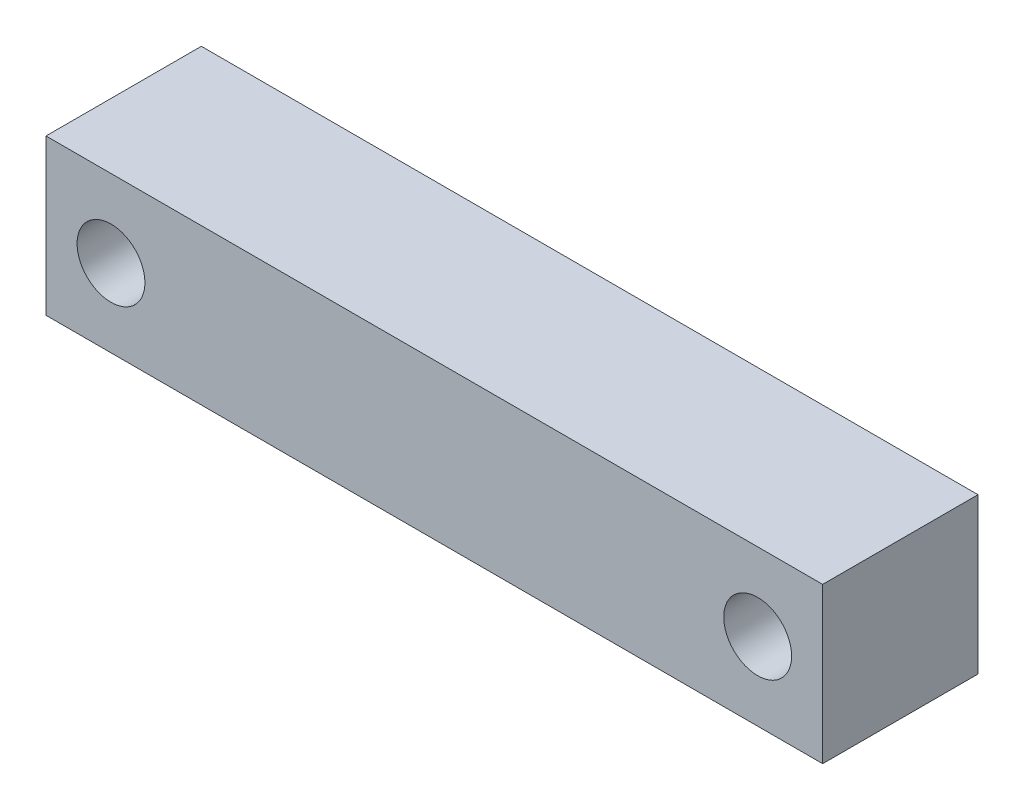
ISO-10303-21;
HEADER;
FILE_DESCRIPTION(('STEP AP214'),'2;1');
FILE_NAME('part.step','',(''),(''),'','','');
FILE_SCHEMA(('AUTOMOTIVE_DESIGN { 1 0 10303 214 1 1 1 1 }'));
ENDSEC;
DATA;
#1=APPLICATION_CONTEXT('core data for automotive mechanical design processes');
#2=APPLICATION_PROTOCOL_DEFINITION('international standard','automotive_design',2000,#1);
#3=PRODUCT_CONTEXT('',#1,'mechanical');
#4=PRODUCT('Part','Part','',(#3));
#5=PRODUCT_RELATED_PRODUCT_CATEGORY('part','',(#4));
#6=PRODUCT_DEFINITION_FORMATION('','',#4);
#7=PRODUCT_DEFINITION_CONTEXT('part definition',#1,'design');
#8=PRODUCT_DEFINITION('design','',#6,#7);
#9=PRODUCT_DEFINITION_SHAPE('','',#8);
#10=(LENGTH_UNIT() NAMED_UNIT(*) SI_UNIT(.MILLI.,.METRE.));
#11=(NAMED_UNIT(*) PLANE_ANGLE_UNIT() SI_UNIT($,.RADIAN.));
#12=(NAMED_UNIT(*) SI_UNIT($,.STERADIAN.) SOLID_ANGLE_UNIT());
#13=UNCERTAINTY_MEASURE_WITH_UNIT(LENGTH_MEASURE(1.E-05),#10,'distance_accuracy_value','');
#14=(GEOMETRIC_REPRESENTATION_CONTEXT(3) GLOBAL_UNCERTAINTY_ASSIGNED_CONTEXT((#13)) GLOBAL_UNIT_ASSIGNED_CONTEXT((#10,
#11,#12)) REPRESENTATION_CONTEXT('',''));
#15=CARTESIAN_POINT('',(0.,0.,0.));
#16=DIRECTION('',(0.,0.,1.));
#17=DIRECTION('',(1.,0.,0.));
#18=AXIS2_PLACEMENT_3D('',#15,#16,#17);
#19=CARTESIAN_POINT('',(12.5,-2.5,5.));
#20=DIRECTION('',(-1.,0.,0.));
#21=DIRECTION('',(0.,0.,1.));
#22=AXIS2_PLACEMENT_3D('',#19,#20,#21);
#23=PLANE('',#22);
#24=DIRECTION('',(0.,1.,0.));
#25=VECTOR('',#24,1.);
#26=CARTESIAN_POINT('',(12.5,-2.5,0.));
#27=LINE('',#26,#25);
#28=CARTESIAN_POINT('',(12.5,-2.5,0.));
#29=VERTEX_POINT('',#28);
#30=CARTESIAN_POINT('',(12.5,2.5,0.));
#31=VERTEX_POINT('',#30);
#32=EDGE_CURVE('E143',#29,#31,#27,.T.);
#33=ORIENTED_EDGE('',*,*,#32,.T.);
#34=DIRECTION('',(0.,0.,-1.));
#35=VECTOR('',#34,1.);
#36=CARTESIAN_POINT('',(12.5,2.5,5.));
#37=LINE('',#36,#35);
#38=CARTESIAN_POINT('',(12.5,2.5,5.));
#39=VERTEX_POINT('',#38);
#40=EDGE_CURVE('E11',#39,#31,#37,.T.);
#41=ORIENTED_EDGE('',*,*,#40,.F.);
#42=DIRECTION('',(0.,1.,0.));
#43=VECTOR('',#42,1.);
#44=CARTESIAN_POINT('',(12.5,-2.5,5.));
#45=LINE('',#44,#43);
#46=CARTESIAN_POINT('',(12.5,-2.5,5.));
#47=VERTEX_POINT('',#46);
#48=EDGE_CURVE('E144',#47,#39,#45,.T.);
#49=ORIENTED_EDGE('',*,*,#48,.F.);
#50=DIRECTION('',(0.,0.,-1.));
#51=VECTOR('',#50,1.);
#52=CARTESIAN_POINT('',(12.5,-2.5,5.));
#53=LINE('',#52,#51);
#54=EDGE_CURVE('E154',#47,#29,#53,.T.);
#55=ORIENTED_EDGE('',*,*,#54,.T.);
#56=EDGE_LOOP('',(#33,#41,#49,#55));
#57=FACE_BOUND('',#56,.T.);
#58=ADVANCED_FACE('F39',(#57),#23,.F.);
#59=CARTESIAN_POINT('',(-12.5,2.5,5.));
#60=DIRECTION('',(0.,-1.,0.));
#61=DIRECTION('',(0.,0.,-1.));
#62=AXIS2_PLACEMENT_3D('',#59,#60,#61);
#63=PLANE('',#62);
#64=DIRECTION('',(-1.,0.,0.));
#65=VECTOR('',#64,1.);
#66=CARTESIAN_POINT('',(-12.5,2.5,0.));
#67=LINE('',#66,#65);
#68=CARTESIAN_POINT('',(-12.5,2.5,0.));
#69=VERTEX_POINT('',#68);
#70=EDGE_CURVE('E157',#31,#69,#67,.T.);
#71=ORIENTED_EDGE('',*,*,#70,.T.);
#72=DIRECTION('',(0.,0.,-1.));
#73=VECTOR('',#72,1.);
#74=CARTESIAN_POINT('',(-12.5,2.5,5.));
#75=LINE('',#74,#73);
#76=CARTESIAN_POINT('',(-12.5,2.5,5.));
#77=VERTEX_POINT('',#76);
#78=EDGE_CURVE('E47',#77,#69,#75,.T.);
#79=ORIENTED_EDGE('',*,*,#78,.F.);
#80=DIRECTION('',(-1.,0.,0.));
#81=VECTOR('',#80,1.);
#82=CARTESIAN_POINT('',(-12.5,2.5,5.));
#83=LINE('',#82,#81);
#84=EDGE_CURVE('E147',#39,#77,#83,.T.);
#85=ORIENTED_EDGE('',*,*,#84,.F.);
#86=ORIENTED_EDGE('',*,*,#40,.T.);
#87=EDGE_LOOP('',(#71,#79,#85,#86));
#88=FACE_BOUND('',#87,.T.);
#89=ADVANCED_FACE('F199',(#88),#63,.F.);
#90=CARTESIAN_POINT('',(-12.5,-2.5,5.));
#91=DIRECTION('',(1.,0.,0.));
#92=DIRECTION('',(0.,0.,-1.));
#93=AXIS2_PLACEMENT_3D('',#90,#91,#92);
#94=PLANE('',#93);
#95=DIRECTION('',(0.,1.,0.));
#96=VECTOR('',#95,1.);
#97=CARTESIAN_POINT('',(-12.5,-1.5,3.));
#98=LINE('',#97,#96);
#99=CARTESIAN_POINT('',(-12.5,-1.5,3.));
#100=VERTEX_POINT('',#99);
#101=CARTESIAN_POINT('',(-12.5,1.5,3.));
#102=VERTEX_POINT('',#101);
#103=EDGE_CURVE('E112',#100,#102,#98,.T.);
#104=ORIENTED_EDGE('',*,*,#103,.F.);
#105=DIRECTION('',(0.,0.,-1.));
#106=VECTOR('',#105,1.);
#107=CARTESIAN_POINT('',(-12.5,-1.5,3.));
#108=LINE('',#107,#106);
#109=CARTESIAN_POINT('',(-12.5,-1.5,0.));
#110=VERTEX_POINT('',#109);
#111=EDGE_CURVE('E183',#100,#110,#108,.T.);
#112=ORIENTED_EDGE('',*,*,#111,.T.);
#113=DIRECTION('',(0.,-1.,0.));
#114=VECTOR('',#113,1.);
#115=CARTESIAN_POINT('',(-12.5,-2.5,0.));
#116=LINE('',#115,#114);
#117=CARTESIAN_POINT('',(-12.5,-2.5,0.));
#118=VERTEX_POINT('',#117);
#119=EDGE_CURVE('E159',#110,#118,#116,.T.);
#120=ORIENTED_EDGE('',*,*,#119,.T.);
#121=DIRECTION('',(0.,0.,-1.));
#122=VECTOR('',#121,1.);
#123=CARTESIAN_POINT('',(-12.5,-2.5,5.));
#124=LINE('',#123,#122);
#125=CARTESIAN_POINT('',(-12.5,-2.5,5.));
#126=VERTEX_POINT('',#125);
#127=EDGE_CURVE('E164',#126,#118,#124,.T.);
#128=ORIENTED_EDGE('',*,*,#127,.F.);
#129=DIRECTION('',(0.,-1.,0.));
#130=VECTOR('',#129,1.);
#131=CARTESIAN_POINT('',(-12.5,-2.5,5.));
#132=LINE('',#131,#130);
#133=EDGE_CURVE('E150',#77,#126,#132,.T.);
#134=ORIENTED_EDGE('',*,*,#133,.F.);
#135=ORIENTED_EDGE('',*,*,#78,.T.);
#136=CARTESIAN_POINT('',(-12.5,1.5,0.));
#137=VERTEX_POINT('',#136);
#138=EDGE_CURVE('E127',#69,#137,#116,.T.);
#139=ORIENTED_EDGE('',*,*,#138,.T.);
#140=DIRECTION('',(0.,0.,-1.));
#141=VECTOR('',#140,1.);
#142=CARTESIAN_POINT('',(-12.5,1.5,3.));
#143=LINE('',#142,#141);
#144=EDGE_CURVE('E54',#102,#137,#143,.T.);
#145=ORIENTED_EDGE('',*,*,#144,.F.);
#146=EDGE_LOOP('',(#104,#112,#120,#128,#134,#135,#139,#145));
#147=FACE_BOUND('',#146,.T.);
#148=ADVANCED_FACE('F124',(#147),#94,.F.);
#149=CARTESIAN_POINT('',(-12.5,-2.5,5.));
#150=DIRECTION('',(0.,1.,0.));
#151=DIRECTION('',(0.,0.,1.));
#152=AXIS2_PLACEMENT_3D('',#149,#150,#151);
#153=PLANE('',#152);
#154=DIRECTION('',(1.,0.,0.));
#155=VECTOR('',#154,1.);
#156=CARTESIAN_POINT('',(-12.5,-2.5,0.));
#157=LINE('',#156,#155);
#158=EDGE_CURVE('E148',#118,#29,#157,.T.);
#159=ORIENTED_EDGE('',*,*,#158,.T.);
#160=ORIENTED_EDGE('',*,*,#54,.F.);
#161=DIRECTION('',(1.,0.,0.));
#162=VECTOR('',#161,1.);
#163=CARTESIAN_POINT('',(-12.5,-2.5,5.));
#164=LINE('',#163,#162);
#165=EDGE_CURVE('E152',#126,#47,#164,.T.);
#166=ORIENTED_EDGE('',*,*,#165,.F.);
#167=ORIENTED_EDGE('',*,*,#127,.T.);
#168=EDGE_LOOP('',(#159,#160,#166,#167));
#169=FACE_BOUND('',#168,.T.);
#170=ADVANCED_FACE('F193',(#169),#153,.F.);
#171=CARTESIAN_POINT('',(0.,0.,5.));
#172=DIRECTION('',(0.,0.,-1.));
#173=DIRECTION('',(-1.,0.,0.));
#174=AXIS2_PLACEMENT_3D('',#171,#172,#173);
#175=PLANE('',#174);
#176=CARTESIAN_POINT('',(-10.4078,0.,5.));
#177=DIRECTION('',(0.,0.,1.));
#178=DIRECTION('',(1.,0.,0.));
#179=AXIS2_PLACEMENT_3D('',#176,#177,#178);
#180=CIRCLE('',#179,1.0922);
#181=CARTESIAN_POINT('',(-9.3156,0.,5.));
#182=VERTEX_POINT('',#181);
#183=EDGE_CURVE('E137',#182,#182,#180,.T.);
#184=ORIENTED_EDGE('',*,*,#183,.F.);
#185=EDGE_LOOP('',(#184));
#186=FACE_BOUND('',#185,.T.);
#187=CARTESIAN_POINT('',(10.4078,0.,5.));
#188=DIRECTION('',(0.,0.,1.));
#189=DIRECTION('',(1.,0.,0.));
#190=AXIS2_PLACEMENT_3D('',#187,#188,#189);
#191=CIRCLE('',#190,1.0922);
#192=CARTESIAN_POINT('',(11.5,0.,5.));
#193=VERTEX_POINT('',#192);
#194=EDGE_CURVE('E140',#193,#193,#191,.T.);
#195=ORIENTED_EDGE('',*,*,#194,.F.);
#196=EDGE_LOOP('',(#195));
#197=FACE_BOUND('',#196,.T.);
#198=ORIENTED_EDGE('',*,*,#48,.T.);
#199=ORIENTED_EDGE('',*,*,#84,.T.);
#200=ORIENTED_EDGE('',*,*,#133,.T.);
#201=ORIENTED_EDGE('',*,*,#165,.T.);
#202=EDGE_LOOP('',(#198,#199,#200,#201));
#203=FACE_BOUND('',#202,.T.);
#204=ADVANCED_FACE('F197',(#186,#197,#203),#175,.F.);
#205=CARTESIAN_POINT('',(0.,0.,0.));
#206=DIRECTION('',(0.,0.,-1.));
#207=DIRECTION('',(-1.,0.,0.));
#208=AXIS2_PLACEMENT_3D('',#205,#206,#207);
#209=PLANE('',#208);
#210=DIRECTION('',(-1.,0.,0.));
#211=VECTOR('',#210,1.);
#212=CARTESIAN_POINT('',(11.5,-1.5,0.));
#213=LINE('',#212,#211);
#214=CARTESIAN_POINT('',(11.5,-1.5,0.));
#215=VERTEX_POINT('',#214);
#216=EDGE_CURVE('E121',#215,#110,#213,.T.);
#217=ORIENTED_EDGE('',*,*,#216,.F.);
#218=DIRECTION('',(0.,-1.,0.));
#219=VECTOR('',#218,1.);
#220=CARTESIAN_POINT('',(11.5,-1.5,0.));
#221=LINE('',#220,#219);
#222=CARTESIAN_POINT('',(11.5,1.5,0.));
#223=VERTEX_POINT('',#222);
#224=EDGE_CURVE('E177',#223,#215,#221,.T.);
#225=ORIENTED_EDGE('',*,*,#224,.F.);
#226=DIRECTION('',(1.,0.,0.));
#227=VECTOR('',#226,1.);
#228=CARTESIAN_POINT('',(11.5,1.5,0.));
#229=LINE('',#228,#227);
#230=EDGE_CURVE('E176',#137,#223,#229,.T.);
#231=ORIENTED_EDGE('',*,*,#230,.F.);
#232=ORIENTED_EDGE('',*,*,#138,.F.);
#233=ORIENTED_EDGE('',*,*,#70,.F.);
#234=ORIENTED_EDGE('',*,*,#32,.F.);
#235=ORIENTED_EDGE('',*,*,#158,.F.);
#236=ORIENTED_EDGE('',*,*,#119,.F.);
#237=EDGE_LOOP('',(#217,#225,#231,#232,#233,#234,#235,#236));
#238=FACE_BOUND('',#237,.T.);
#239=ADVANCED_FACE('F173',(#238),#209,.T.);
#240=CARTESIAN_POINT('',(10.4078,0.,5.));
#241=DIRECTION('',(0.,0.,1.));
#242=DIRECTION('',(1.,0.,0.));
#243=AXIS2_PLACEMENT_3D('',#240,#241,#242);
#244=CYLINDRICAL_SURFACE('',#243,1.0922);
#245=CARTESIAN_POINT('',(10.4078,0.,3.));
#246=DIRECTION('',(0.,0.,1.));
#247=DIRECTION('',(1.,0.,0.));
#248=AXIS2_PLACEMENT_3D('',#245,#246,#247);
#249=CIRCLE('',#248,1.0922);
#250=CARTESIAN_POINT('',(11.5,0.,3.));
#251=VERTEX_POINT('',#250);
#252=EDGE_CURVE('E134',#251,#251,#249,.F.);
#253=ORIENTED_EDGE('',*,*,#252,.T.);
#254=EDGE_LOOP('',(#253));
#255=FACE_BOUND('',#254,.T.);
#256=ORIENTED_EDGE('',*,*,#194,.T.);
#257=EDGE_LOOP('',(#256));
#258=FACE_BOUND('',#257,.T.);
#259=ADVANCED_FACE('F214',(#255,#258),#244,.F.);
#260=CARTESIAN_POINT('',(-10.4078,0.,5.));
#261=DIRECTION('',(0.,0.,1.));
#262=DIRECTION('',(1.,0.,0.));
#263=AXIS2_PLACEMENT_3D('',#260,#261,#262);
#264=CYLINDRICAL_SURFACE('',#263,1.0922);
#265=CARTESIAN_POINT('',(-10.4078,0.,3.));
#266=DIRECTION('',(0.,0.,1.));
#267=DIRECTION('',(1.,0.,0.));
#268=AXIS2_PLACEMENT_3D('',#265,#266,#267);
#269=CIRCLE('',#268,1.0922);
#270=CARTESIAN_POINT('',(-9.3156,0.,3.));
#271=VERTEX_POINT('',#270);
#272=EDGE_CURVE('E42',#271,#271,#269,.F.);
#273=ORIENTED_EDGE('',*,*,#272,.T.);
#274=EDGE_LOOP('',(#273));
#275=FACE_BOUND('',#274,.T.);
#276=ORIENTED_EDGE('',*,*,#183,.T.);
#277=EDGE_LOOP('',(#276));
#278=FACE_BOUND('',#277,.T.);
#279=ADVANCED_FACE('F220',(#275,#278),#264,.F.);
#280=CARTESIAN_POINT('',(11.5,-1.5,3.));
#281=DIRECTION('',(1.,0.,0.));
#282=DIRECTION('',(0.,0.,-1.));
#283=AXIS2_PLACEMENT_3D('',#280,#281,#282);
#284=PLANE('',#283);
#285=DIRECTION('',(0.,-1.,0.));
#286=VECTOR('',#285,1.);
#287=CARTESIAN_POINT('',(11.5,-1.5,3.));
#288=LINE('',#287,#286);
#289=CARTESIAN_POINT('',(11.5,1.5,3.));
#290=VERTEX_POINT('',#289);
#291=EDGE_CURVE('E62',#290,#251,#288,.T.);
#292=ORIENTED_EDGE('',*,*,#291,.F.);
#293=DIRECTION('',(0.,0.,-1.));
#294=VECTOR('',#293,1.);
#295=CARTESIAN_POINT('',(11.5,1.5,3.));
#296=LINE('',#295,#294);
#297=EDGE_CURVE('E110',#290,#223,#296,.T.);
#298=ORIENTED_EDGE('',*,*,#297,.T.);
#299=ORIENTED_EDGE('',*,*,#224,.T.);
#300=DIRECTION('',(0.,0.,-1.));
#301=VECTOR('',#300,1.);
#302=CARTESIAN_POINT('',(11.5,-1.5,3.));
#303=LINE('',#302,#301);
#304=CARTESIAN_POINT('',(11.5,-1.5,3.));
#305=VERTEX_POINT('',#304);
#306=EDGE_CURVE('E129',#305,#215,#303,.T.);
#307=ORIENTED_EDGE('',*,*,#306,.F.);
#308=EDGE_CURVE('E111',#251,#305,#288,.T.);
#309=ORIENTED_EDGE('',*,*,#308,.F.);
#310=EDGE_LOOP('',(#292,#298,#299,#307,#309));
#311=FACE_BOUND('',#310,.T.);
#312=ADVANCED_FACE('F224',(#311),#284,.F.);
#313=CARTESIAN_POINT('',(0.,0.,3.));
#314=DIRECTION('',(0.,0.,1.));
#315=DIRECTION('',(1.,0.,0.));
#316=AXIS2_PLACEMENT_3D('',#313,#314,#315);
#317=PLANE('',#316);
#318=ORIENTED_EDGE('',*,*,#272,.F.);
#319=EDGE_LOOP('',(#318));
#320=FACE_BOUND('',#319,.T.);
#321=ORIENTED_EDGE('',*,*,#308,.T.);
#322=DIRECTION('',(-1.,0.,0.));
#323=VECTOR('',#322,1.);
#324=CARTESIAN_POINT('',(11.5,-1.5,3.));
#325=LINE('',#324,#323);
#326=EDGE_CURVE('E118',#305,#100,#325,.T.);
#327=ORIENTED_EDGE('',*,*,#326,.T.);
#328=ORIENTED_EDGE('',*,*,#103,.T.);
#329=DIRECTION('',(1.,0.,0.));
#330=VECTOR('',#329,1.);
#331=CARTESIAN_POINT('',(11.5,1.5,3.));
#332=LINE('',#331,#330);
#333=EDGE_CURVE('E107',#102,#290,#332,.T.);
#334=ORIENTED_EDGE('',*,*,#333,.T.);
#335=ORIENTED_EDGE('',*,*,#291,.T.);
#336=ORIENTED_EDGE('',*,*,#252,.F.);
#337=EDGE_LOOP('',(#321,#327,#328,#334,#335,#336));
#338=FACE_BOUND('',#337,.T.);
#339=ADVANCED_FACE('F116',(#320,#338),#317,.F.);
#340=CARTESIAN_POINT('',(11.5,-1.5,3.));
#341=DIRECTION('',(0.,-1.,0.));
#342=DIRECTION('',(0.,0.,-1.));
#343=AXIS2_PLACEMENT_3D('',#340,#341,#342);
#344=PLANE('',#343);
#345=ORIENTED_EDGE('',*,*,#216,.T.);
#346=ORIENTED_EDGE('',*,*,#111,.F.);
#347=ORIENTED_EDGE('',*,*,#326,.F.);
#348=ORIENTED_EDGE('',*,*,#306,.T.);
#349=EDGE_LOOP('',(#345,#346,#347,#348));
#350=FACE_BOUND('',#349,.T.);
#351=ADVANCED_FACE('F187',(#350),#344,.F.);
#352=CARTESIAN_POINT('',(11.5,1.5,3.));
#353=DIRECTION('',(0.,1.,0.));
#354=DIRECTION('',(0.,0.,1.));
#355=AXIS2_PLACEMENT_3D('',#352,#353,#354);
#356=PLANE('',#355);
#357=ORIENTED_EDGE('',*,*,#230,.T.);
#358=ORIENTED_EDGE('',*,*,#297,.F.);
#359=ORIENTED_EDGE('',*,*,#333,.F.);
#360=ORIENTED_EDGE('',*,*,#144,.T.);
#361=EDGE_LOOP('',(#357,#358,#359,#360));
#362=FACE_BOUND('',#361,.T.);
#363=ADVANCED_FACE('F109',(#362),#356,.F.);
#364=CLOSED_SHELL('',(#58,#89,#148,#170,#204,#239,#259,#279,#312,#339,#351,#363));
#365=MANIFOLD_SOLID_BREP('B2',#364);
#366=ADVANCED_BREP_SHAPE_REPRESENTATION('',(#18,#365),#14);
#367=SHAPE_DEFINITION_REPRESENTATION(#9,#366);
ENDSEC;
END-ISO-10303-21;
